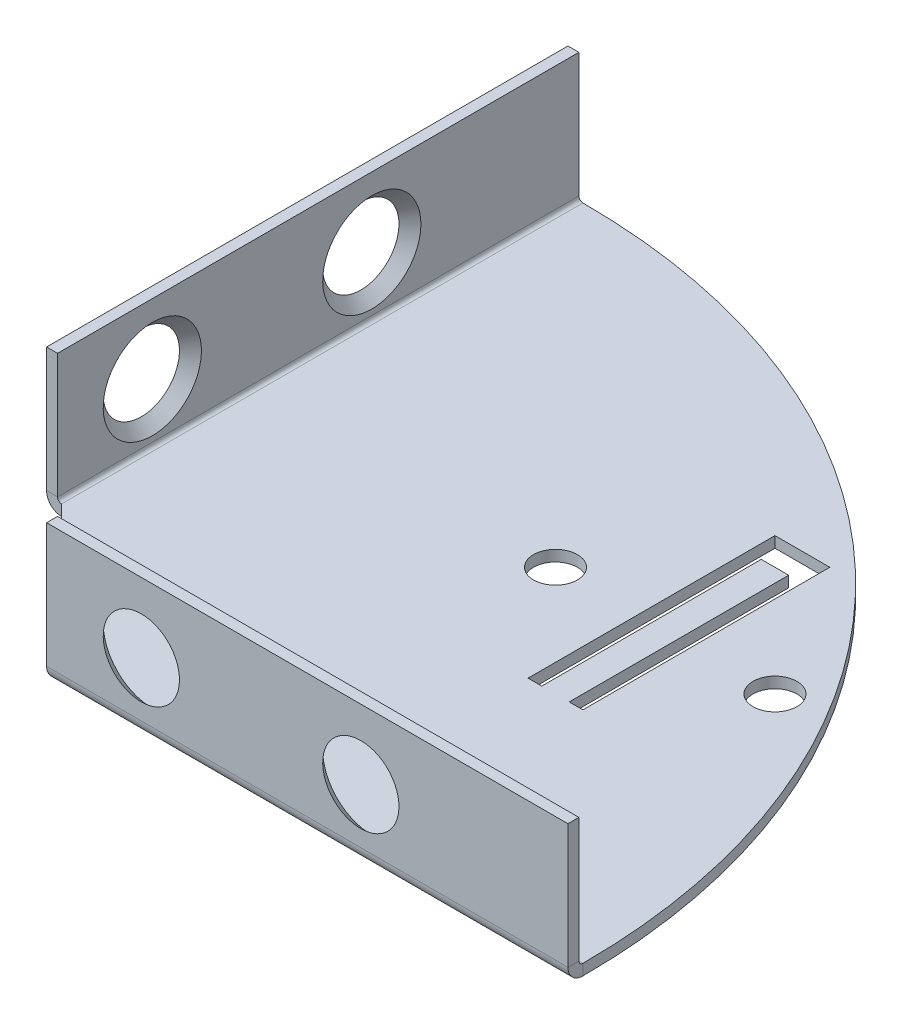
ISO-10303-21;
HEADER;
FILE_DESCRIPTION(('STEP AP214'),'2;1');
FILE_NAME('part.step','',(''),(''),'','','');
FILE_SCHEMA(('AUTOMOTIVE_DESIGN { 1 0 10303 214 1 1 1 1 }'));
ENDSEC;
DATA;
#1=APPLICATION_CONTEXT('core data for automotive mechanical design processes');
#2=APPLICATION_PROTOCOL_DEFINITION('international standard','automotive_design',2000,#1);
#3=PRODUCT_CONTEXT('',#1,'mechanical');
#4=PRODUCT('Part','Part','',(#3));
#5=PRODUCT_RELATED_PRODUCT_CATEGORY('part','',(#4));
#6=PRODUCT_DEFINITION_FORMATION('','',#4);
#7=PRODUCT_DEFINITION_CONTEXT('part definition',#1,'design');
#8=PRODUCT_DEFINITION('design','',#6,#7);
#9=PRODUCT_DEFINITION_SHAPE('','',#8);
#10=(LENGTH_UNIT() NAMED_UNIT(*) SI_UNIT(.MILLI.,.METRE.));
#11=(NAMED_UNIT(*) PLANE_ANGLE_UNIT() SI_UNIT($,.RADIAN.));
#12=(NAMED_UNIT(*) SI_UNIT($,.STERADIAN.) SOLID_ANGLE_UNIT());
#13=UNCERTAINTY_MEASURE_WITH_UNIT(LENGTH_MEASURE(1.E-05),#10,'distance_accuracy_value','');
#14=(GEOMETRIC_REPRESENTATION_CONTEXT(3) GLOBAL_UNCERTAINTY_ASSIGNED_CONTEXT((#13)) GLOBAL_UNIT_ASSIGNED_CONTEXT((#10,
#11,#12)) REPRESENTATION_CONTEXT('',''));
#15=CARTESIAN_POINT('',(0.,0.,0.));
#16=DIRECTION('',(0.,0.,1.));
#17=DIRECTION('',(1.,0.,0.));
#18=AXIS2_PLACEMENT_3D('',#15,#16,#17);
#19=CARTESIAN_POINT('',(0.,-2.,0.));
#20=DIRECTION('',(0.,1.,0.));
#21=DIRECTION('',(0.,0.,1.));
#22=AXIS2_PLACEMENT_3D('',#19,#20,#21);
#23=CYLINDRICAL_SURFACE('',#22,120.);
#24=CARTESIAN_POINT('',(0.,0.,0.));
#25=DIRECTION('',(0.,1.,0.));
#26=DIRECTION('',(0.,0.,1.));
#27=AXIS2_PLACEMENT_3D('',#24,#25,#26);
#28=CIRCLE('',#27,120.);
#29=CARTESIAN_POINT('',(120.,0.,0.));
#30=VERTEX_POINT('',#29);
#31=CARTESIAN_POINT('',(0.,0.,-120.));
#32=VERTEX_POINT('',#31);
#33=EDGE_CURVE('E434',#30,#32,#28,.T.);
#34=ORIENTED_EDGE('',*,*,#33,.F.);
#35=DIRECTION('',(0.,1.,0.));
#36=VECTOR('',#35,1.);
#37=CARTESIAN_POINT('',(120.,-2.,0.));
#38=LINE('',#37,#36);
#39=CARTESIAN_POINT('',(120.,-2.00000000000001,0.));
#40=VERTEX_POINT('',#39);
#41=EDGE_CURVE('E13',#40,#30,#38,.T.);
#42=ORIENTED_EDGE('',*,*,#41,.F.);
#43=CARTESIAN_POINT('',(0.,-2.,0.));
#44=DIRECTION('',(0.,1.,0.));
#45=DIRECTION('',(0.,0.,1.));
#46=AXIS2_PLACEMENT_3D('',#43,#44,#45);
#47=CIRCLE('',#46,120.);
#48=CARTESIAN_POINT('',(0.,-2.,-120.));
#49=VERTEX_POINT('',#48);
#50=EDGE_CURVE('E446',#40,#49,#47,.T.);
#51=ORIENTED_EDGE('',*,*,#50,.T.);
#52=DIRECTION('',(0.,1.,0.));
#53=VECTOR('',#52,1.);
#54=CARTESIAN_POINT('',(0.,-2.,-120.));
#55=LINE('',#54,#53);
#56=EDGE_CURVE('E89',#49,#32,#55,.T.);
#57=ORIENTED_EDGE('',*,*,#56,.T.);
#58=EDGE_LOOP('',(#34,#42,#51,#57));
#59=FACE_BOUND('',#58,.T.);
#60=ADVANCED_FACE('F86',(#59),#23,.T.);
#61=CARTESIAN_POINT('',(0.,-2.,-25.));
#62=DIRECTION('',(-0.707106781186547,0.,0.707106781186547));
#63=DIRECTION('',(0.707106781186548,0.,0.707106781186548));
#64=AXIS2_PLACEMENT_3D('',#61,#62,#63);
#65=PLANE('',#64);
#66=DIRECTION('',(0.707106781186547,0.,0.707106781186547));
#67=VECTOR('',#66,1.);
#68=CARTESIAN_POINT('',(0.,0.,-25.));
#69=LINE('',#68,#67);
#70=CARTESIAN_POINT('',(0.,0.,-25.));
#71=VERTEX_POINT('',#70);
#72=CARTESIAN_POINT('',(25.,0.,0.));
#73=VERTEX_POINT('',#72);
#74=EDGE_CURVE('E469',#71,#73,#69,.T.);
#75=ORIENTED_EDGE('',*,*,#74,.F.);
#76=DIRECTION('',(0.,1.,0.));
#77=VECTOR('',#76,1.);
#78=CARTESIAN_POINT('',(0.,-2.,-25.));
#79=LINE('',#78,#77);
#80=CARTESIAN_POINT('',(0.,-2.,-25.));
#81=VERTEX_POINT('',#80);
#82=EDGE_CURVE('E477',#81,#71,#79,.T.);
#83=ORIENTED_EDGE('',*,*,#82,.F.);
#84=DIRECTION('',(0.707106781186547,0.,0.707106781186547));
#85=VECTOR('',#84,1.);
#86=CARTESIAN_POINT('',(0.,-2.,-25.));
#87=LINE('',#86,#85);
#88=CARTESIAN_POINT('',(25.,-2.,0.));
#89=VERTEX_POINT('',#88);
#90=EDGE_CURVE('E455',#81,#89,#87,.T.);
#91=ORIENTED_EDGE('',*,*,#90,.T.);
#92=DIRECTION('',(0.,1.,0.));
#93=VECTOR('',#92,1.);
#94=CARTESIAN_POINT('',(25.,-2.,0.));
#95=LINE('',#94,#93);
#96=EDGE_CURVE('E95',#89,#73,#95,.T.);
#97=ORIENTED_EDGE('',*,*,#96,.T.);
#98=EDGE_LOOP('',(#75,#83,#91,#97));
#99=FACE_BOUND('',#98,.T.);
#100=ADVANCED_FACE('F522',(#99),#65,.T.);
#101=CARTESIAN_POINT('',(0.,-2.,0.));
#102=DIRECTION('',(0.,1.,0.));
#103=DIRECTION('',(0.,0.,1.));
#104=AXIS2_PLACEMENT_3D('',#101,#102,#103);
#105=PLANE('',#104);
#106=CARTESIAN_POINT('',(55.,-2.,-60.));
#107=DIRECTION('',(0.,1.,0.));
#108=DIRECTION('',(0.,0.,1.));
#109=AXIS2_PLACEMENT_3D('',#106,#107,#108);
#110=CIRCLE('',#109,4.00000000000001);
#111=CARTESIAN_POINT('',(55.,-2.,-56.));
#112=VERTEX_POINT('',#111);
#113=EDGE_CURVE('E321',#112,#112,#110,.T.);
#114=ORIENTED_EDGE('',*,*,#113,.T.);
#115=EDGE_LOOP('',(#114));
#116=FACE_BOUND('',#115,.T.);
#117=CARTESIAN_POINT('',(95.,-2.,-60.));
#118=DIRECTION('',(0.,1.,0.));
#119=DIRECTION('',(0.,0.,1.));
#120=AXIS2_PLACEMENT_3D('',#117,#118,#119);
#121=CIRCLE('',#120,4.00000000000001);
#122=CARTESIAN_POINT('',(95.,-2.,-56.));
#123=VERTEX_POINT('',#122);
#124=EDGE_CURVE('E317',#123,#123,#121,.T.);
#125=ORIENTED_EDGE('',*,*,#124,.T.);
#126=EDGE_LOOP('',(#125));
#127=FACE_BOUND('',#126,.T.);
#128=DIRECTION('',(1.,0.,0.));
#129=VECTOR('',#128,1.);
#130=CARTESIAN_POINT('',(0.,-2.,-80.));
#131=LINE('',#130,#129);
#132=CARTESIAN_POINT('',(72.5,-2.,-80.));
#133=VERTEX_POINT('',#132);
#134=CARTESIAN_POINT('',(77.5,-2.,-80.));
#135=VERTEX_POINT('',#134);
#136=EDGE_CURVE('E309',#133,#135,#131,.T.);
#137=ORIENTED_EDGE('',*,*,#136,.T.);
#138=DIRECTION('',(0.,0.,1.));
#139=VECTOR('',#138,1.);
#140=CARTESIAN_POINT('',(77.5,-2.,0.));
#141=LINE('',#140,#139);
#142=CARTESIAN_POINT('',(77.5,-2.,-40.));
#143=VERTEX_POINT('',#142);
#144=EDGE_CURVE('E313',#135,#143,#141,.T.);
#145=ORIENTED_EDGE('',*,*,#144,.T.);
#146=DIRECTION('',(1.,0.,0.));
#147=VECTOR('',#146,1.);
#148=CARTESIAN_POINT('',(0.,-2.,-40.));
#149=LINE('',#148,#147);
#150=CARTESIAN_POINT('',(80.,-2.,-40.));
#151=VERTEX_POINT('',#150);
#152=EDGE_CURVE('E290',#143,#151,#149,.T.);
#153=ORIENTED_EDGE('',*,*,#152,.T.);
#154=DIRECTION('',(0.,0.,1.));
#155=VECTOR('',#154,1.);
#156=CARTESIAN_POINT('',(80.,-2.,0.));
#157=LINE('',#156,#155);
#158=CARTESIAN_POINT('',(80.,-2.,-85.));
#159=VERTEX_POINT('',#158);
#160=EDGE_CURVE('E231',#159,#151,#157,.T.);
#161=ORIENTED_EDGE('',*,*,#160,.F.);
#162=DIRECTION('',(1.,0.,0.));
#163=VECTOR('',#162,1.);
#164=CARTESIAN_POINT('',(0.,-2.,-85.));
#165=LINE('',#164,#163);
#166=CARTESIAN_POINT('',(70.,-2.,-85.));
#167=VERTEX_POINT('',#166);
#168=EDGE_CURVE('E296',#167,#159,#165,.T.);
#169=ORIENTED_EDGE('',*,*,#168,.F.);
#170=DIRECTION('',(0.,0.,1.));
#171=VECTOR('',#170,1.);
#172=CARTESIAN_POINT('',(70.,-2.,0.));
#173=LINE('',#172,#171);
#174=CARTESIAN_POINT('',(70.,-2.,-40.));
#175=VERTEX_POINT('',#174);
#176=EDGE_CURVE('E299',#167,#175,#173,.T.);
#177=ORIENTED_EDGE('',*,*,#176,.T.);
#178=DIRECTION('',(-1.,0.,0.));
#179=VECTOR('',#178,1.);
#180=CARTESIAN_POINT('',(1.11022302462517E-13,-2.,-40.0000000000002));
#181=LINE('',#180,#179);
#182=CARTESIAN_POINT('',(72.5,-2.,-40.));
#183=VERTEX_POINT('',#182);
#184=EDGE_CURVE('E303',#183,#175,#181,.T.);
#185=ORIENTED_EDGE('',*,*,#184,.F.);
#186=DIRECTION('',(0.,0.,1.));
#187=VECTOR('',#186,1.);
#188=CARTESIAN_POINT('',(72.5,-2.,0.));
#189=LINE('',#188,#187);
#190=EDGE_CURVE('E306',#133,#183,#189,.T.);
#191=ORIENTED_EDGE('',*,*,#190,.F.);
#192=EDGE_LOOP('',(#137,#145,#153,#161,#169,#177,#185,#191));
#193=FACE_BOUND('',#192,.T.);
#194=ORIENTED_EDGE('',*,*,#50,.F.);
#195=DIRECTION('',(1.,0.,0.));
#196=VECTOR('',#195,1.);
#197=CARTESIAN_POINT('',(25.,-2.,0.));
#198=LINE('',#197,#196);
#199=EDGE_CURVE('E458',#89,#40,#198,.T.);
#200=ORIENTED_EDGE('',*,*,#199,.F.);
#201=ORIENTED_EDGE('',*,*,#90,.F.);
#202=DIRECTION('',(0.,0.,1.));
#203=VECTOR('',#202,1.);
#204=CARTESIAN_POINT('',(0.,-2.,-120.));
#205=LINE('',#204,#203);
#206=EDGE_CURVE('E450',#49,#81,#205,.T.);
#207=ORIENTED_EDGE('',*,*,#206,.F.);
#208=EDGE_LOOP('',(#194,#200,#201,#207));
#209=FACE_BOUND('',#208,.T.);
#210=ADVANCED_FACE('F518',(#116,#127,#193,#209),#105,.F.);
#211=CARTESIAN_POINT('',(0.,0.,0.));
#212=DIRECTION('',(0.,1.,0.));
#213=DIRECTION('',(0.,0.,1.));
#214=AXIS2_PLACEMENT_3D('',#211,#212,#213);
#215=PLANE('',#214);
#216=CARTESIAN_POINT('',(55.,0.,-60.));
#217=DIRECTION('',(0.,1.,0.));
#218=DIRECTION('',(0.,0.,1.));
#219=AXIS2_PLACEMENT_3D('',#216,#217,#218);
#220=CIRCLE('',#219,4.00000000000001);
#221=CARTESIAN_POINT('',(55.,0.,-56.));
#222=VERTEX_POINT('',#221);
#223=EDGE_CURVE('E293',#222,#222,#220,.T.);
#224=ORIENTED_EDGE('',*,*,#223,.F.);
#225=EDGE_LOOP('',(#224));
#226=FACE_BOUND('',#225,.T.);
#227=CARTESIAN_POINT('',(95.,0.,-60.));
#228=DIRECTION('',(0.,1.,0.));
#229=DIRECTION('',(0.,0.,1.));
#230=AXIS2_PLACEMENT_3D('',#227,#228,#229);
#231=CIRCLE('',#230,4.00000000000001);
#232=CARTESIAN_POINT('',(95.,0.,-56.));
#233=VERTEX_POINT('',#232);
#234=EDGE_CURVE('E273',#233,#233,#231,.T.);
#235=ORIENTED_EDGE('',*,*,#234,.F.);
#236=EDGE_LOOP('',(#235));
#237=FACE_BOUND('',#236,.T.);
#238=DIRECTION('',(0.,0.,1.));
#239=VECTOR('',#238,1.);
#240=CARTESIAN_POINT('',(77.5,0.,0.));
#241=LINE('',#240,#239);
#242=CARTESIAN_POINT('',(77.5,0.,-80.));
#243=VERTEX_POINT('',#242);
#244=CARTESIAN_POINT('',(77.5,0.,-40.));
#245=VERTEX_POINT('',#244);
#246=EDGE_CURVE('E111',#243,#245,#241,.T.);
#247=ORIENTED_EDGE('',*,*,#246,.F.);
#248=DIRECTION('',(1.,0.,0.));
#249=VECTOR('',#248,1.);
#250=CARTESIAN_POINT('',(0.,0.,-80.));
#251=LINE('',#250,#249);
#252=CARTESIAN_POINT('',(72.5,0.,-80.));
#253=VERTEX_POINT('',#252);
#254=EDGE_CURVE('E266',#253,#243,#251,.T.);
#255=ORIENTED_EDGE('',*,*,#254,.F.);
#256=DIRECTION('',(0.,0.,1.));
#257=VECTOR('',#256,1.);
#258=CARTESIAN_POINT('',(72.5,0.,0.));
#259=LINE('',#258,#257);
#260=CARTESIAN_POINT('',(72.5,0.,-40.));
#261=VERTEX_POINT('',#260);
#262=EDGE_CURVE('E262',#253,#261,#259,.T.);
#263=ORIENTED_EDGE('',*,*,#262,.T.);
#264=DIRECTION('',(-1.,0.,0.));
#265=VECTOR('',#264,1.);
#266=CARTESIAN_POINT('',(1.11022302462517E-13,0.,-40.0000000000002));
#267=LINE('',#266,#265);
#268=CARTESIAN_POINT('',(70.,0.,-40.));
#269=VERTEX_POINT('',#268);
#270=EDGE_CURVE('E258',#261,#269,#267,.T.);
#271=ORIENTED_EDGE('',*,*,#270,.T.);
#272=DIRECTION('',(0.,0.,1.));
#273=VECTOR('',#272,1.);
#274=CARTESIAN_POINT('',(70.,0.,0.));
#275=LINE('',#274,#273);
#276=CARTESIAN_POINT('',(70.,0.,-85.));
#277=VERTEX_POINT('',#276);
#278=EDGE_CURVE('E251',#277,#269,#275,.T.);
#279=ORIENTED_EDGE('',*,*,#278,.F.);
#280=DIRECTION('',(1.,0.,0.));
#281=VECTOR('',#280,1.);
#282=CARTESIAN_POINT('',(0.,0.,-85.));
#283=LINE('',#282,#281);
#284=CARTESIAN_POINT('',(80.,0.,-85.));
#285=VERTEX_POINT('',#284);
#286=EDGE_CURVE('E247',#277,#285,#283,.T.);
#287=ORIENTED_EDGE('',*,*,#286,.T.);
#288=DIRECTION('',(0.,0.,1.));
#289=VECTOR('',#288,1.);
#290=CARTESIAN_POINT('',(80.,0.,0.));
#291=LINE('',#290,#289);
#292=CARTESIAN_POINT('',(80.,0.,-40.));
#293=VERTEX_POINT('',#292);
#294=EDGE_CURVE('E228',#285,#293,#291,.T.);
#295=ORIENTED_EDGE('',*,*,#294,.T.);
#296=DIRECTION('',(1.,0.,0.));
#297=VECTOR('',#296,1.);
#298=CARTESIAN_POINT('',(0.,0.,-40.));
#299=LINE('',#298,#297);
#300=EDGE_CURVE('E238',#245,#293,#299,.T.);
#301=ORIENTED_EDGE('',*,*,#300,.F.);
#302=EDGE_LOOP('',(#247,#255,#263,#271,#279,#287,#295,#301));
#303=FACE_BOUND('',#302,.T.);
#304=ORIENTED_EDGE('',*,*,#33,.T.);
#305=DIRECTION('',(0.,0.,1.));
#306=VECTOR('',#305,1.);
#307=CARTESIAN_POINT('',(0.,0.,-120.));
#308=LINE('',#307,#306);
#309=EDGE_CURVE('E465',#32,#71,#308,.T.);
#310=ORIENTED_EDGE('',*,*,#309,.T.);
#311=ORIENTED_EDGE('',*,*,#74,.T.);
#312=DIRECTION('',(1.,0.,0.));
#313=VECTOR('',#312,1.);
#314=CARTESIAN_POINT('',(25.,0.,0.));
#315=LINE('',#314,#313);
#316=EDGE_CURVE('E451',#73,#30,#315,.T.);
#317=ORIENTED_EDGE('',*,*,#316,.T.);
#318=EDGE_LOOP('',(#304,#310,#311,#317));
#319=FACE_BOUND('',#318,.T.);
#320=ADVANCED_FACE('F243',(#226,#237,#303,#319),#215,.T.);
#321=CARTESIAN_POINT('',(25.,0.736599999999997,0.));
#322=DIRECTION('',(-1.,0.,0.));
#323=DIRECTION('',(0.,0.,1.));
#324=AXIS2_PLACEMENT_3D('',#321,#322,#323);
#325=PLANE('',#324);
#326=DIRECTION('',(0.,0.,1.));
#327=VECTOR('',#326,1.);
#328=CARTESIAN_POINT('',(25.,0.736599999999997,2.73660000000008));
#329=LINE('',#328,#327);
#330=CARTESIAN_POINT('',(25.,0.736599999999995,0.7366));
#331=VERTEX_POINT('',#330);
#332=CARTESIAN_POINT('',(25.,0.736599999999988,2.7366));
#333=VERTEX_POINT('',#332);
#334=EDGE_CURVE('E374',#331,#333,#329,.T.);
#335=ORIENTED_EDGE('',*,*,#334,.F.);
#336=CARTESIAN_POINT('',(25.,0.736599999999997,0.));
#337=DIRECTION('',(1.,0.,0.));
#338=DIRECTION('',(0.,0.,-1.));
#339=AXIS2_PLACEMENT_3D('',#336,#337,#338);
#340=CIRCLE('',#339,0.736600000000003);
#341=EDGE_CURVE('E439',#73,#331,#340,.F.);
#342=ORIENTED_EDGE('',*,*,#341,.F.);
#343=ORIENTED_EDGE('',*,*,#96,.F.);
#344=CARTESIAN_POINT('',(25.,0.736599999999997,0.));
#345=DIRECTION('',(1.,0.,0.));
#346=DIRECTION('',(0.,0.,-1.));
#347=AXIS2_PLACEMENT_3D('',#344,#345,#346);
#348=CIRCLE('',#347,2.7366);
#349=EDGE_CURVE('E430',#89,#333,#348,.F.);
#350=ORIENTED_EDGE('',*,*,#349,.T.);
#351=EDGE_LOOP('',(#335,#342,#343,#350));
#352=FACE_BOUND('',#351,.T.);
#353=ADVANCED_FACE('F529',(#352),#325,.T.);
#354=CARTESIAN_POINT('',(120.,0.736599999999997,0.));
#355=DIRECTION('',(-1.,0.,0.));
#356=DIRECTION('',(0.,0.,1.));
#357=AXIS2_PLACEMENT_3D('',#354,#355,#356);
#358=PLANE('',#357);
#359=CARTESIAN_POINT('',(120.,0.736599999999997,0.));
#360=DIRECTION('',(1.,0.,0.));
#361=DIRECTION('',(0.,0.,-1.));
#362=AXIS2_PLACEMENT_3D('',#359,#360,#361);
#363=CIRCLE('',#362,0.736600000000003);
#364=CARTESIAN_POINT('',(120.,0.736599999999995,0.736600000000007));
#365=VERTEX_POINT('',#364);
#366=EDGE_CURVE('E389',#365,#30,#363,.T.);
#367=ORIENTED_EDGE('',*,*,#366,.F.);
#368=DIRECTION('',(0.,0.,1.));
#369=VECTOR('',#368,1.);
#370=CARTESIAN_POINT('',(120.,0.736599999999997,0.7366));
#371=LINE('',#370,#369);
#372=CARTESIAN_POINT('',(120.,0.736599999999997,2.7366));
#373=VERTEX_POINT('',#372);
#374=EDGE_CURVE('E420',#365,#373,#371,.T.);
#375=ORIENTED_EDGE('',*,*,#374,.T.);
#376=CARTESIAN_POINT('',(120.,0.736599999999997,0.));
#377=DIRECTION('',(1.,0.,0.));
#378=DIRECTION('',(0.,0.,-1.));
#379=AXIS2_PLACEMENT_3D('',#376,#377,#378);
#380=CIRCLE('',#379,2.7366);
#381=EDGE_CURVE('E435',#373,#40,#380,.T.);
#382=ORIENTED_EDGE('',*,*,#381,.T.);
#383=ORIENTED_EDGE('',*,*,#41,.T.);
#384=EDGE_LOOP('',(#367,#375,#382,#383));
#385=FACE_BOUND('',#384,.T.);
#386=ADVANCED_FACE('F550',(#385),#358,.F.);
#387=CARTESIAN_POINT('',(120.,0.736599999999997,0.));
#388=DIRECTION('',(1.,0.,0.));
#389=DIRECTION('',(0.,0.,1.));
#390=AXIS2_PLACEMENT_3D('',#387,#388,#389);
#391=CYLINDRICAL_SURFACE('',#390,2.7366);
#392=ORIENTED_EDGE('',*,*,#199,.T.);
#393=ORIENTED_EDGE('',*,*,#381,.F.);
#394=DIRECTION('',(1.,0.,0.));
#395=VECTOR('',#394,1.);
#396=CARTESIAN_POINT('',(0.,0.736599999999997,2.7366));
#397=LINE('',#396,#395);
#398=EDGE_CURVE('E416',#333,#373,#397,.T.);
#399=ORIENTED_EDGE('',*,*,#398,.F.);
#400=ORIENTED_EDGE('',*,*,#349,.F.);
#401=EDGE_LOOP('',(#392,#393,#399,#400));
#402=FACE_BOUND('',#401,.T.);
#403=ADVANCED_FACE('F552',(#402),#391,.T.);
#404=CARTESIAN_POINT('',(120.,0.736599999999997,0.));
#405=DIRECTION('',(1.,0.,0.));
#406=DIRECTION('',(0.,0.,1.));
#407=AXIS2_PLACEMENT_3D('',#404,#405,#406);
#408=CYLINDRICAL_SURFACE('',#407,0.736600000000003);
#409=ORIENTED_EDGE('',*,*,#316,.F.);
#410=ORIENTED_EDGE('',*,*,#341,.T.);
#411=DIRECTION('',(-1.,0.,0.));
#412=VECTOR('',#411,1.);
#413=CARTESIAN_POINT('',(25.,0.736599999999997,0.7366));
#414=LINE('',#413,#412);
#415=EDGE_CURVE('E424',#331,#365,#414,.F.);
#416=ORIENTED_EDGE('',*,*,#415,.T.);
#417=ORIENTED_EDGE('',*,*,#366,.T.);
#418=EDGE_LOOP('',(#409,#410,#416,#417));
#419=FACE_BOUND('',#418,.T.);
#420=ADVANCED_FACE('F525',(#419),#408,.F.);
#421=CARTESIAN_POINT('',(120.,0.,2.7366));
#422=DIRECTION('',(1.,0.,0.));
#423=DIRECTION('',(0.,0.,-1.));
#424=AXIS2_PLACEMENT_3D('',#421,#422,#423);
#425=PLANE('',#424);
#426=DIRECTION('',(0.,-1.,0.));
#427=VECTOR('',#426,1.);
#428=CARTESIAN_POINT('',(120.,0.,2.7366));
#429=LINE('',#428,#427);
#430=CARTESIAN_POINT('',(120.,23.4,2.73660000000008));
#431=VERTEX_POINT('',#430);
#432=EDGE_CURVE('E394',#431,#373,#429,.T.);
#433=ORIENTED_EDGE('',*,*,#432,.T.);
#434=ORIENTED_EDGE('',*,*,#374,.F.);
#435=DIRECTION('',(0.,1.,0.));
#436=VECTOR('',#435,1.);
#437=CARTESIAN_POINT('',(120.,0.,0.736599999999997));
#438=LINE('',#437,#436);
#439=CARTESIAN_POINT('',(120.,23.4,0.736600000000079));
#440=VERTEX_POINT('',#439);
#441=EDGE_CURVE('E405',#440,#365,#438,.F.);
#442=ORIENTED_EDGE('',*,*,#441,.F.);
#443=DIRECTION('',(0.,0.,-1.));
#444=VECTOR('',#443,1.);
#445=CARTESIAN_POINT('',(120.,23.4,2.73660000000008));
#446=LINE('',#445,#444);
#447=EDGE_CURVE('E386',#431,#440,#446,.T.);
#448=ORIENTED_EDGE('',*,*,#447,.F.);
#449=EDGE_LOOP('',(#433,#434,#442,#448));
#450=FACE_BOUND('',#449,.T.);
#451=ADVANCED_FACE('F548',(#450),#425,.T.);
#452=CARTESIAN_POINT('',(25.,23.4,2.73660000000008));
#453=DIRECTION('',(-1.,0.,0.));
#454=DIRECTION('',(0.,0.,1.));
#455=AXIS2_PLACEMENT_3D('',#452,#453,#454);
#456=PLANE('',#455);
#457=DIRECTION('',(0.,-1.,0.));
#458=VECTOR('',#457,1.);
#459=CARTESIAN_POINT('',(25.,0.,0.736599999999997));
#460=LINE('',#459,#458);
#461=CARTESIAN_POINT('',(25.,23.4,0.736600000000079));
#462=VERTEX_POINT('',#461);
#463=EDGE_CURVE('E413',#331,#462,#460,.F.);
#464=ORIENTED_EDGE('',*,*,#463,.F.);
#465=ORIENTED_EDGE('',*,*,#334,.T.);
#466=DIRECTION('',(0.,1.,0.));
#467=VECTOR('',#466,1.);
#468=CARTESIAN_POINT('',(25.,23.4,2.73660000000008));
#469=LINE('',#468,#467);
#470=CARTESIAN_POINT('',(25.,23.4,2.73660000000008));
#471=VERTEX_POINT('',#470);
#472=EDGE_CURVE('E402',#333,#471,#469,.T.);
#473=ORIENTED_EDGE('',*,*,#472,.T.);
#474=DIRECTION('',(0.,0.,-1.));
#475=VECTOR('',#474,1.);
#476=CARTESIAN_POINT('',(25.,23.4,2.73660000000008));
#477=LINE('',#476,#475);
#478=EDGE_CURVE('E390',#471,#462,#477,.T.);
#479=ORIENTED_EDGE('',*,*,#478,.T.);
#480=EDGE_LOOP('',(#464,#465,#473,#479));
#481=FACE_BOUND('',#480,.T.);
#482=ADVANCED_FACE('F534',(#481),#456,.T.);
#483=CARTESIAN_POINT('',(0.,0.,2.7366));
#484=DIRECTION('',(0.,0.,1.));
#485=DIRECTION('',(0.,-1.,0.));
#486=AXIS2_PLACEMENT_3D('',#483,#484,#485);
#487=PLANE('',#486);
#488=CARTESIAN_POINT('',(42.2634,10.7,2.73660000000003));
#489=DIRECTION('',(0.,0.,-1.));
#490=DIRECTION('',(0.,1.,0.));
#491=AXIS2_PLACEMENT_3D('',#488,#489,#490);
#492=CIRCLE('',#491,6.94999999999999);
#493=CARTESIAN_POINT('',(42.2634,17.65,2.73660000000006));
#494=VERTEX_POINT('',#493);
#495=EDGE_CURVE('E922',#494,#494,#492,.T.);
#496=ORIENTED_EDGE('',*,*,#495,.T.);
#497=EDGE_LOOP('',(#496));
#498=FACE_BOUND('',#497,.T.);
#499=CARTESIAN_POINT('',(82.2634,10.7,2.73660000000003));
#500=DIRECTION('',(0.,0.,-1.));
#501=DIRECTION('',(0.,1.,0.));
#502=AXIS2_PLACEMENT_3D('',#499,#500,#501);
#503=CIRCLE('',#502,6.94999999999999);
#504=CARTESIAN_POINT('',(82.2634,17.65,2.73660000000006));
#505=VERTEX_POINT('',#504);
#506=EDGE_CURVE('E923',#505,#505,#503,.T.);
#507=ORIENTED_EDGE('',*,*,#506,.T.);
#508=EDGE_LOOP('',(#507));
#509=FACE_BOUND('',#508,.T.);
#510=ORIENTED_EDGE('',*,*,#472,.F.);
#511=ORIENTED_EDGE('',*,*,#398,.T.);
#512=ORIENTED_EDGE('',*,*,#432,.F.);
#513=DIRECTION('',(1.,0.,0.));
#514=VECTOR('',#513,1.);
#515=CARTESIAN_POINT('',(120.,23.4,2.73660000000008));
#516=LINE('',#515,#514);
#517=EDGE_CURVE('E398',#471,#431,#516,.T.);
#518=ORIENTED_EDGE('',*,*,#517,.F.);
#519=EDGE_LOOP('',(#510,#511,#512,#518));
#520=FACE_BOUND('',#519,.T.);
#521=ADVANCED_FACE('F538',(#498,#509,#520),#487,.T.);
#522=CARTESIAN_POINT('',(0.,0.,0.736599999999997));
#523=DIRECTION('',(0.,0.,1.));
#524=DIRECTION('',(0.,-1.,0.));
#525=AXIS2_PLACEMENT_3D('',#522,#523,#524);
#526=PLANE('',#525);
#527=CARTESIAN_POINT('',(42.2634,10.7,0.736600000000035));
#528=DIRECTION('',(0.,0.,-1.));
#529=DIRECTION('',(0.,1.,0.));
#530=AXIS2_PLACEMENT_3D('',#527,#528,#529);
#531=CIRCLE('',#530,8.95);
#532=CARTESIAN_POINT('',(42.2634,19.65,0.736600000000066));
#533=VERTEX_POINT('',#532);
#534=EDGE_CURVE('E918',#533,#533,#531,.T.);
#535=ORIENTED_EDGE('',*,*,#534,.F.);
#536=EDGE_LOOP('',(#535));
#537=FACE_BOUND('',#536,.T.);
#538=CARTESIAN_POINT('',(82.2634,10.7,0.736600000000035));
#539=DIRECTION('',(0.,0.,-1.));
#540=DIRECTION('',(0.,1.,0.));
#541=AXIS2_PLACEMENT_3D('',#538,#539,#540);
#542=CIRCLE('',#541,8.95);
#543=CARTESIAN_POINT('',(82.2634,19.65,0.736600000000066));
#544=VERTEX_POINT('',#543);
#545=EDGE_CURVE('E909',#544,#544,#542,.T.);
#546=ORIENTED_EDGE('',*,*,#545,.F.);
#547=EDGE_LOOP('',(#546));
#548=FACE_BOUND('',#547,.T.);
#549=ORIENTED_EDGE('',*,*,#415,.F.);
#550=ORIENTED_EDGE('',*,*,#463,.T.);
#551=DIRECTION('',(-1.,0.,0.));
#552=VECTOR('',#551,1.);
#553=CARTESIAN_POINT('',(0.,23.4,0.736600000000079));
#554=LINE('',#553,#552);
#555=EDGE_CURVE('E409',#462,#440,#554,.F.);
#556=ORIENTED_EDGE('',*,*,#555,.T.);
#557=ORIENTED_EDGE('',*,*,#441,.T.);
#558=EDGE_LOOP('',(#549,#550,#556,#557));
#559=FACE_BOUND('',#558,.T.);
#560=ADVANCED_FACE('F545',(#537,#548,#559),#526,.F.);
#561=CARTESIAN_POINT('',(120.,23.4,2.73660000000008));
#562=DIRECTION('',(0.,1.,0.));
#563=DIRECTION('',(0.,0.,1.));
#564=AXIS2_PLACEMENT_3D('',#561,#562,#563);
#565=PLANE('',#564);
#566=ORIENTED_EDGE('',*,*,#555,.F.);
#567=ORIENTED_EDGE('',*,*,#478,.F.);
#568=ORIENTED_EDGE('',*,*,#517,.T.);
#569=ORIENTED_EDGE('',*,*,#447,.T.);
#570=EDGE_LOOP('',(#566,#567,#568,#569));
#571=FACE_BOUND('',#570,.T.);
#572=ADVANCED_FACE('F542',(#571),#565,.T.);
#573=CARTESIAN_POINT('',(0.,0.7366,-120.));
#574=DIRECTION('',(0.,0.,-1.));
#575=DIRECTION('',(-1.,0.,0.));
#576=AXIS2_PLACEMENT_3D('',#573,#574,#575);
#577=PLANE('',#576);
#578=DIRECTION('',(-1.,0.,0.));
#579=VECTOR('',#578,1.);
#580=CARTESIAN_POINT('',(-2.7366,0.73659999999999,-120.));
#581=LINE('',#580,#579);
#582=CARTESIAN_POINT('',(-0.7366,0.736599999999997,-120.));
#583=VERTEX_POINT('',#582);
#584=CARTESIAN_POINT('',(-2.7366,0.73659999999999,-120.));
#585=VERTEX_POINT('',#584);
#586=EDGE_CURVE('E325',#583,#585,#581,.T.);
#587=ORIENTED_EDGE('',*,*,#586,.F.);
#588=CARTESIAN_POINT('',(0.,0.7366,-120.));
#589=DIRECTION('',(0.,0.,1.));
#590=DIRECTION('',(1.,0.,0.));
#591=AXIS2_PLACEMENT_3D('',#588,#589,#590);
#592=CIRCLE('',#591,0.736599999999996);
#593=EDGE_CURVE('E379',#32,#583,#592,.F.);
#594=ORIENTED_EDGE('',*,*,#593,.F.);
#595=ORIENTED_EDGE('',*,*,#56,.F.);
#596=CARTESIAN_POINT('',(0.,0.7366,-120.));
#597=DIRECTION('',(0.,0.,1.));
#598=DIRECTION('',(1.,0.,0.));
#599=AXIS2_PLACEMENT_3D('',#596,#597,#598);
#600=CIRCLE('',#599,2.7366);
#601=EDGE_CURVE('E370',#49,#585,#600,.F.);
#602=ORIENTED_EDGE('',*,*,#601,.T.);
#603=EDGE_LOOP('',(#587,#594,#595,#602));
#604=FACE_BOUND('',#603,.T.);
#605=ADVANCED_FACE('F495',(#604),#577,.T.);
#606=CARTESIAN_POINT('',(0.,0.7366,-25.));
#607=DIRECTION('',(0.,0.,-1.));
#608=DIRECTION('',(-1.,0.,0.));
#609=AXIS2_PLACEMENT_3D('',#606,#607,#608);
#610=PLANE('',#609);
#611=CARTESIAN_POINT('',(0.,0.7366,-25.));
#612=DIRECTION('',(0.,0.,1.));
#613=DIRECTION('',(1.,0.,0.));
#614=AXIS2_PLACEMENT_3D('',#611,#612,#613);
#615=CIRCLE('',#614,0.736599999999996);
#616=CARTESIAN_POINT('',(-0.736599999999993,0.736599999999997,-25.));
#617=VERTEX_POINT('',#616);
#618=EDGE_CURVE('E329',#617,#71,#615,.T.);
#619=ORIENTED_EDGE('',*,*,#618,.F.);
#620=DIRECTION('',(-1.,0.,0.));
#621=VECTOR('',#620,1.);
#622=CARTESIAN_POINT('',(-0.7366,0.736599999999997,-25.));
#623=LINE('',#622,#621);
#624=CARTESIAN_POINT('',(-2.7366,0.73659999999999,-25.));
#625=VERTEX_POINT('',#624);
#626=EDGE_CURVE('E360',#617,#625,#623,.T.);
#627=ORIENTED_EDGE('',*,*,#626,.T.);
#628=CARTESIAN_POINT('',(0.,0.7366,-25.));
#629=DIRECTION('',(0.,0.,1.));
#630=DIRECTION('',(1.,0.,0.));
#631=AXIS2_PLACEMENT_3D('',#628,#629,#630);
#632=CIRCLE('',#631,2.7366);
#633=EDGE_CURVE('E375',#625,#81,#632,.T.);
#634=ORIENTED_EDGE('',*,*,#633,.T.);
#635=ORIENTED_EDGE('',*,*,#82,.T.);
#636=EDGE_LOOP('',(#619,#627,#634,#635));
#637=FACE_BOUND('',#636,.T.);
#638=ADVANCED_FACE('F514',(#637),#610,.F.);
#639=CARTESIAN_POINT('',(0.,0.7366,-25.));
#640=DIRECTION('',(0.,0.,1.));
#641=DIRECTION('',(-1.,0.,0.));
#642=AXIS2_PLACEMENT_3D('',#639,#640,#641);
#643=CYLINDRICAL_SURFACE('',#642,2.7366);
#644=ORIENTED_EDGE('',*,*,#206,.T.);
#645=ORIENTED_EDGE('',*,*,#633,.F.);
#646=DIRECTION('',(0.,0.,1.));
#647=VECTOR('',#646,1.);
#648=CARTESIAN_POINT('',(-2.7366,0.73659999999999,0.));
#649=LINE('',#648,#647);
#650=EDGE_CURVE('E356',#585,#625,#649,.T.);
#651=ORIENTED_EDGE('',*,*,#650,.F.);
#652=ORIENTED_EDGE('',*,*,#601,.F.);
#653=EDGE_LOOP('',(#644,#645,#651,#652));
#654=FACE_BOUND('',#653,.T.);
#655=ADVANCED_FACE('F516',(#654),#643,.T.);
#656=CARTESIAN_POINT('',(0.,0.7366,-25.));
#657=DIRECTION('',(0.,0.,1.));
#658=DIRECTION('',(-1.,0.,0.));
#659=AXIS2_PLACEMENT_3D('',#656,#657,#658);
#660=CYLINDRICAL_SURFACE('',#659,0.736599999999996);
#661=ORIENTED_EDGE('',*,*,#309,.F.);
#662=ORIENTED_EDGE('',*,*,#593,.T.);
#663=DIRECTION('',(0.,0.,-1.));
#664=VECTOR('',#663,1.);
#665=CARTESIAN_POINT('',(-0.7366,0.736599999999997,-120.));
#666=LINE('',#665,#664);
#667=EDGE_CURVE('E364',#583,#617,#666,.F.);
#668=ORIENTED_EDGE('',*,*,#667,.T.);
#669=ORIENTED_EDGE('',*,*,#618,.T.);
#670=EDGE_LOOP('',(#661,#662,#668,#669));
#671=FACE_BOUND('',#670,.T.);
#672=ADVANCED_FACE('F493',(#671),#660,.F.);
#673=CARTESIAN_POINT('',(-2.7366,0.,-25.));
#674=DIRECTION('',(0.,0.,1.));
#675=DIRECTION('',(1.,0.,0.));
#676=AXIS2_PLACEMENT_3D('',#673,#674,#675);
#677=PLANE('',#676);
#678=DIRECTION('',(0.,-1.,0.));
#679=VECTOR('',#678,1.);
#680=CARTESIAN_POINT('',(-2.7366,0.,-25.));
#681=LINE('',#680,#679);
#682=CARTESIAN_POINT('',(-2.73660000000008,23.4,-25.));
#683=VERTEX_POINT('',#682);
#684=EDGE_CURVE('E334',#683,#625,#681,.T.);
#685=ORIENTED_EDGE('',*,*,#684,.T.);
#686=ORIENTED_EDGE('',*,*,#626,.F.);
#687=DIRECTION('',(0.,1.,0.));
#688=VECTOR('',#687,1.);
#689=CARTESIAN_POINT('',(-0.736599999999997,0.,-25.));
#690=LINE('',#689,#688);
#691=CARTESIAN_POINT('',(-0.736600000000079,23.4,-25.));
#692=VERTEX_POINT('',#691);
#693=EDGE_CURVE('E345',#692,#617,#690,.F.);
#694=ORIENTED_EDGE('',*,*,#693,.F.);
#695=DIRECTION('',(1.,0.,0.));
#696=VECTOR('',#695,1.);
#697=CARTESIAN_POINT('',(-2.73660000000008,23.4,-25.));
#698=LINE('',#697,#696);
#699=EDGE_CURVE('E326',#683,#692,#698,.T.);
#700=ORIENTED_EDGE('',*,*,#699,.F.);
#701=EDGE_LOOP('',(#685,#686,#694,#700));
#702=FACE_BOUND('',#701,.T.);
#703=ADVANCED_FACE('F513',(#702),#677,.T.);
#704=CARTESIAN_POINT('',(-2.73660000000008,23.4,-120.));
#705=DIRECTION('',(0.,0.,-1.));
#706=DIRECTION('',(-1.,0.,0.));
#707=AXIS2_PLACEMENT_3D('',#704,#705,#706);
#708=PLANE('',#707);
#709=DIRECTION('',(0.,-1.,0.));
#710=VECTOR('',#709,1.);
#711=CARTESIAN_POINT('',(-0.736599999999997,0.,-120.));
#712=LINE('',#711,#710);
#713=CARTESIAN_POINT('',(-0.736600000000079,23.4,-120.));
#714=VERTEX_POINT('',#713);
#715=EDGE_CURVE('E353',#583,#714,#712,.F.);
#716=ORIENTED_EDGE('',*,*,#715,.F.);
#717=ORIENTED_EDGE('',*,*,#586,.T.);
#718=DIRECTION('',(0.,1.,0.));
#719=VECTOR('',#718,1.);
#720=CARTESIAN_POINT('',(-2.73660000000008,23.4,-120.));
#721=LINE('',#720,#719);
#722=CARTESIAN_POINT('',(-2.73660000000008,23.4,-120.));
#723=VERTEX_POINT('',#722);
#724=EDGE_CURVE('E342',#585,#723,#721,.T.);
#725=ORIENTED_EDGE('',*,*,#724,.T.);
#726=DIRECTION('',(1.,0.,0.));
#727=VECTOR('',#726,1.);
#728=CARTESIAN_POINT('',(-2.73660000000008,23.4,-120.));
#729=LINE('',#728,#727);
#730=EDGE_CURVE('E330',#723,#714,#729,.T.);
#731=ORIENTED_EDGE('',*,*,#730,.T.);
#732=EDGE_LOOP('',(#716,#717,#725,#731));
#733=FACE_BOUND('',#732,.T.);
#734=ADVANCED_FACE('F499',(#733),#708,.T.);
#735=CARTESIAN_POINT('',(-2.7366,0.,0.));
#736=DIRECTION('',(-1.,0.,0.));
#737=DIRECTION('',(0.,-1.,0.));
#738=AXIS2_PLACEMENT_3D('',#735,#736,#737);
#739=PLANE('',#738);
#740=CARTESIAN_POINT('',(-2.73660000000003,10.6999999999996,-42.2633999999999));
#741=DIRECTION('',(1.,0.,0.));
#742=DIRECTION('',(0.,1.,0.));
#743=AXIS2_PLACEMENT_3D('',#740,#741,#742);
#744=CIRCLE('',#743,6.94999999999999);
#745=CARTESIAN_POINT('',(-2.73660000000006,17.6499999999996,-42.2633999999999));
#746=VERTEX_POINT('',#745);
#747=EDGE_CURVE('E900',#746,#746,#744,.T.);
#748=ORIENTED_EDGE('',*,*,#747,.T.);
#749=EDGE_LOOP('',(#748));
#750=FACE_BOUND('',#749,.T.);
#751=CARTESIAN_POINT('',(-2.73660000000003,10.6999999999996,-82.2633999999999));
#752=DIRECTION('',(1.,0.,0.));
#753=DIRECTION('',(0.,1.,0.));
#754=AXIS2_PLACEMENT_3D('',#751,#752,#753);
#755=CIRCLE('',#754,6.94999999999999);
#756=CARTESIAN_POINT('',(-2.73660000000006,17.6499999999996,-82.2633999999999));
#757=VERTEX_POINT('',#756);
#758=EDGE_CURVE('E905',#757,#757,#755,.T.);
#759=ORIENTED_EDGE('',*,*,#758,.T.);
#760=EDGE_LOOP('',(#759));
#761=FACE_BOUND('',#760,.T.);
#762=ORIENTED_EDGE('',*,*,#724,.F.);
#763=ORIENTED_EDGE('',*,*,#650,.T.);
#764=ORIENTED_EDGE('',*,*,#684,.F.);
#765=DIRECTION('',(0.,0.,1.));
#766=VECTOR('',#765,1.);
#767=CARTESIAN_POINT('',(-2.73660000000008,23.4,-25.));
#768=LINE('',#767,#766);
#769=EDGE_CURVE('E338',#723,#683,#768,.T.);
#770=ORIENTED_EDGE('',*,*,#769,.F.);
#771=EDGE_LOOP('',(#762,#763,#764,#770));
#772=FACE_BOUND('',#771,.T.);
#773=ADVANCED_FACE('F503',(#750,#761,#772),#739,.T.);
#774=CARTESIAN_POINT('',(-0.736599999999997,0.,0.));
#775=DIRECTION('',(-1.,0.,0.));
#776=DIRECTION('',(0.,-1.,0.));
#777=AXIS2_PLACEMENT_3D('',#774,#775,#776);
#778=PLANE('',#777);
#779=CARTESIAN_POINT('',(-0.736600000000035,10.6999999999996,-42.2633999999999));
#780=DIRECTION('',(1.,0.,0.));
#781=DIRECTION('',(0.,1.,0.));
#782=AXIS2_PLACEMENT_3D('',#779,#780,#781);
#783=CIRCLE('',#782,8.95);
#784=CARTESIAN_POINT('',(-0.736600000000066,19.6499999999996,-42.2633999999999));
#785=VERTEX_POINT('',#784);
#786=EDGE_CURVE('E903',#785,#785,#783,.T.);
#787=ORIENTED_EDGE('',*,*,#786,.F.);
#788=EDGE_LOOP('',(#787));
#789=FACE_BOUND('',#788,.T.);
#790=CARTESIAN_POINT('',(-0.736600000000035,10.6999999999996,-82.2633999999999));
#791=DIRECTION('',(1.,0.,0.));
#792=DIRECTION('',(0.,1.,0.));
#793=AXIS2_PLACEMENT_3D('',#790,#791,#792);
#794=CIRCLE('',#793,8.95);
#795=CARTESIAN_POINT('',(-0.736600000000066,19.6499999999996,-82.2633999999999));
#796=VERTEX_POINT('',#795);
#797=EDGE_CURVE('E912',#796,#796,#794,.T.);
#798=ORIENTED_EDGE('',*,*,#797,.F.);
#799=EDGE_LOOP('',(#798));
#800=FACE_BOUND('',#799,.T.);
#801=ORIENTED_EDGE('',*,*,#667,.F.);
#802=ORIENTED_EDGE('',*,*,#715,.T.);
#803=DIRECTION('',(0.,0.,-1.));
#804=VECTOR('',#803,1.);
#805=CARTESIAN_POINT('',(-0.736600000000079,23.4,0.));
#806=LINE('',#805,#804);
#807=EDGE_CURVE('E349',#714,#692,#806,.F.);
#808=ORIENTED_EDGE('',*,*,#807,.T.);
#809=ORIENTED_EDGE('',*,*,#693,.T.);
#810=EDGE_LOOP('',(#801,#802,#808,#809));
#811=FACE_BOUND('',#810,.T.);
#812=ADVANCED_FACE('F510',(#789,#800,#811),#778,.F.);
#813=CARTESIAN_POINT('',(-2.73660000000008,23.4,-25.));
#814=DIRECTION('',(0.,1.,0.));
#815=DIRECTION('',(-1.,0.,0.));
#816=AXIS2_PLACEMENT_3D('',#813,#814,#815);
#817=PLANE('',#816);
#818=ORIENTED_EDGE('',*,*,#807,.F.);
#819=ORIENTED_EDGE('',*,*,#730,.F.);
#820=ORIENTED_EDGE('',*,*,#769,.T.);
#821=ORIENTED_EDGE('',*,*,#699,.T.);
#822=EDGE_LOOP('',(#818,#819,#820,#821));
#823=FACE_BOUND('',#822,.T.);
#824=ADVANCED_FACE('F507',(#823),#817,.T.);
#825=CARTESIAN_POINT('',(77.5,-10.,0.));
#826=DIRECTION('',(-1.,0.,0.));
#827=DIRECTION('',(0.,0.,1.));
#828=AXIS2_PLACEMENT_3D('',#825,#826,#827);
#829=PLANE('',#828);
#830=DIRECTION('',(0.,1.,0.));
#831=VECTOR('',#830,1.);
#832=CARTESIAN_POINT('',(77.5,-10.,-80.));
#833=LINE('',#832,#831);
#834=EDGE_CURVE('E270',#135,#243,#833,.T.);
#835=ORIENTED_EDGE('',*,*,#834,.T.);
#836=ORIENTED_EDGE('',*,*,#246,.T.);
#837=DIRECTION('',(0.,1.,0.));
#838=VECTOR('',#837,1.);
#839=CARTESIAN_POINT('',(77.5,-10.,-40.));
#840=LINE('',#839,#838);
#841=EDGE_CURVE('E235',#143,#245,#840,.T.);
#842=ORIENTED_EDGE('',*,*,#841,.F.);
#843=ORIENTED_EDGE('',*,*,#144,.F.);
#844=EDGE_LOOP('',(#835,#836,#842,#843));
#845=FACE_BOUND('',#844,.T.);
#846=ADVANCED_FACE('F703',(#845),#829,.F.);
#847=CARTESIAN_POINT('',(0.,-10.,-80.));
#848=DIRECTION('',(0.,0.,1.));
#849=DIRECTION('',(1.,0.,0.));
#850=AXIS2_PLACEMENT_3D('',#847,#848,#849);
#851=PLANE('',#850);
#852=DIRECTION('',(0.,1.,0.));
#853=VECTOR('',#852,1.);
#854=CARTESIAN_POINT('',(72.5,-10.,-80.));
#855=LINE('',#854,#853);
#856=EDGE_CURVE('E274',#133,#253,#855,.T.);
#857=ORIENTED_EDGE('',*,*,#856,.T.);
#858=ORIENTED_EDGE('',*,*,#254,.T.);
#859=ORIENTED_EDGE('',*,*,#834,.F.);
#860=ORIENTED_EDGE('',*,*,#136,.F.);
#861=EDGE_LOOP('',(#857,#858,#859,#860));
#862=FACE_BOUND('',#861,.T.);
#863=ADVANCED_FACE('F726',(#862),#851,.F.);
#864=CARTESIAN_POINT('',(72.5,-10.,0.));
#865=DIRECTION('',(-1.,0.,0.));
#866=DIRECTION('',(0.,0.,1.));
#867=AXIS2_PLACEMENT_3D('',#864,#865,#866);
#868=PLANE('',#867);
#869=ORIENTED_EDGE('',*,*,#190,.T.);
#870=DIRECTION('',(0.,1.,0.));
#871=VECTOR('',#870,1.);
#872=CARTESIAN_POINT('',(72.5,-10.,-40.));
#873=LINE('',#872,#871);
#874=EDGE_CURVE('E277',#183,#261,#873,.T.);
#875=ORIENTED_EDGE('',*,*,#874,.T.);
#876=ORIENTED_EDGE('',*,*,#262,.F.);
#877=ORIENTED_EDGE('',*,*,#856,.F.);
#878=EDGE_LOOP('',(#869,#875,#876,#877));
#879=FACE_BOUND('',#878,.T.);
#880=ADVANCED_FACE('F736',(#879),#868,.T.);
#881=CARTESIAN_POINT('',(1.11022302462517E-13,-10.,-40.0000000000002));
#882=DIRECTION('',(0.,0.,-1.));
#883=DIRECTION('',(-1.,0.,0.));
#884=AXIS2_PLACEMENT_3D('',#881,#882,#883);
#885=PLANE('',#884);
#886=ORIENTED_EDGE('',*,*,#184,.T.);
#887=DIRECTION('',(0.,1.,0.));
#888=VECTOR('',#887,1.);
#889=CARTESIAN_POINT('',(70.,-10.,-40.));
#890=LINE('',#889,#888);
#891=EDGE_CURVE('E280',#175,#269,#890,.T.);
#892=ORIENTED_EDGE('',*,*,#891,.T.);
#893=ORIENTED_EDGE('',*,*,#270,.F.);
#894=ORIENTED_EDGE('',*,*,#874,.F.);
#895=EDGE_LOOP('',(#886,#892,#893,#894));
#896=FACE_BOUND('',#895,.T.);
#897=ADVANCED_FACE('F747',(#896),#885,.T.);
#898=CARTESIAN_POINT('',(70.,-10.,0.));
#899=DIRECTION('',(-1.,0.,0.));
#900=DIRECTION('',(0.,0.,1.));
#901=AXIS2_PLACEMENT_3D('',#898,#899,#900);
#902=PLANE('',#901);
#903=DIRECTION('',(0.,1.,0.));
#904=VECTOR('',#903,1.);
#905=CARTESIAN_POINT('',(70.,-10.,-85.));
#906=LINE('',#905,#904);
#907=EDGE_CURVE('E283',#167,#277,#906,.T.);
#908=ORIENTED_EDGE('',*,*,#907,.T.);
#909=ORIENTED_EDGE('',*,*,#278,.T.);
#910=ORIENTED_EDGE('',*,*,#891,.F.);
#911=ORIENTED_EDGE('',*,*,#176,.F.);
#912=EDGE_LOOP('',(#908,#909,#910,#911));
#913=FACE_BOUND('',#912,.T.);
#914=ADVANCED_FACE('F758',(#913),#902,.F.);
#915=CARTESIAN_POINT('',(0.,-10.,-85.));
#916=DIRECTION('',(0.,0.,1.));
#917=DIRECTION('',(1.,0.,0.));
#918=AXIS2_PLACEMENT_3D('',#915,#916,#917);
#919=PLANE('',#918);
#920=ORIENTED_EDGE('',*,*,#168,.T.);
#921=DIRECTION('',(0.,1.,0.));
#922=VECTOR('',#921,1.);
#923=CARTESIAN_POINT('',(80.,-10.,-85.));
#924=LINE('',#923,#922);
#925=EDGE_CURVE('E234',#159,#285,#924,.T.);
#926=ORIENTED_EDGE('',*,*,#925,.T.);
#927=ORIENTED_EDGE('',*,*,#286,.F.);
#928=ORIENTED_EDGE('',*,*,#907,.F.);
#929=EDGE_LOOP('',(#920,#926,#927,#928));
#930=FACE_BOUND('',#929,.T.);
#931=ADVANCED_FACE('F769',(#930),#919,.T.);
#932=CARTESIAN_POINT('',(80.,-10.,0.));
#933=DIRECTION('',(-1.,0.,0.));
#934=DIRECTION('',(0.,0.,1.));
#935=AXIS2_PLACEMENT_3D('',#932,#933,#934);
#936=PLANE('',#935);
#937=ORIENTED_EDGE('',*,*,#160,.T.);
#938=DIRECTION('',(0.,1.,0.));
#939=VECTOR('',#938,1.);
#940=CARTESIAN_POINT('',(80.,-10.,-40.));
#941=LINE('',#940,#939);
#942=EDGE_CURVE('E103',#151,#293,#941,.T.);
#943=ORIENTED_EDGE('',*,*,#942,.T.);
#944=ORIENTED_EDGE('',*,*,#294,.F.);
#945=ORIENTED_EDGE('',*,*,#925,.F.);
#946=EDGE_LOOP('',(#937,#943,#944,#945));
#947=FACE_BOUND('',#946,.T.);
#948=ADVANCED_FACE('F225',(#947),#936,.T.);
#949=CARTESIAN_POINT('',(0.,-10.,-40.));
#950=DIRECTION('',(0.,0.,1.));
#951=DIRECTION('',(1.,0.,0.));
#952=AXIS2_PLACEMENT_3D('',#949,#950,#951);
#953=PLANE('',#952);
#954=ORIENTED_EDGE('',*,*,#841,.T.);
#955=ORIENTED_EDGE('',*,*,#300,.T.);
#956=ORIENTED_EDGE('',*,*,#942,.F.);
#957=ORIENTED_EDGE('',*,*,#152,.F.);
#958=EDGE_LOOP('',(#954,#955,#956,#957));
#959=FACE_BOUND('',#958,.T.);
#960=ADVANCED_FACE('F239',(#959),#953,.F.);
#961=CARTESIAN_POINT('',(95.,-10.,-60.));
#962=DIRECTION('',(0.,1.,0.));
#963=DIRECTION('',(0.,0.,1.));
#964=AXIS2_PLACEMENT_3D('',#961,#962,#963);
#965=CYLINDRICAL_SURFACE('',#964,4.00000000000001);
#966=ORIENTED_EDGE('',*,*,#234,.T.);
#967=EDGE_LOOP('',(#966));
#968=FACE_BOUND('',#967,.T.);
#969=ORIENTED_EDGE('',*,*,#124,.F.);
#970=EDGE_LOOP('',(#969));
#971=FACE_BOUND('',#970,.T.);
#972=ADVANCED_FACE('F799',(#968,#971),#965,.F.);
#973=CARTESIAN_POINT('',(55.,-10.,-60.));
#974=DIRECTION('',(0.,1.,0.));
#975=DIRECTION('',(0.,0.,1.));
#976=AXIS2_PLACEMENT_3D('',#973,#974,#975);
#977=CYLINDRICAL_SURFACE('',#976,4.00000000000001);
#978=ORIENTED_EDGE('',*,*,#223,.T.);
#979=EDGE_LOOP('',(#978));
#980=FACE_BOUND('',#979,.T.);
#981=ORIENTED_EDGE('',*,*,#113,.F.);
#982=EDGE_LOOP('',(#981));
#983=FACE_BOUND('',#982,.T.);
#984=ADVANCED_FACE('F809',(#980,#983),#977,.F.);
#985=CARTESIAN_POINT('',(82.2634,10.7,0.736600000000035));
#986=DIRECTION('',(0.,0.,-1.));
#987=DIRECTION('',(0.,1.,0.));
#988=AXIS2_PLACEMENT_3D('',#985,#986,#987);
#989=CONICAL_SURFACE('',#988,8.95,0.78539816339745);
#990=ORIENTED_EDGE('',*,*,#506,.F.);
#991=EDGE_LOOP('',(#990));
#992=FACE_BOUND('',#991,.T.);
#993=ORIENTED_EDGE('',*,*,#545,.T.);
#994=EDGE_LOOP('',(#993));
#995=FACE_BOUND('',#994,.T.);
#996=ADVANCED_FACE('F820',(#992,#995),#989,.F.);
#997=CARTESIAN_POINT('',(42.2634,10.7,0.736600000000035));
#998=DIRECTION('',(0.,0.,-1.));
#999=DIRECTION('',(0.,1.,0.));
#1000=AXIS2_PLACEMENT_3D('',#997,#998,#999);
#1001=CONICAL_SURFACE('',#1000,8.95,0.78539816339745);
#1002=ORIENTED_EDGE('',*,*,#495,.F.);
#1003=EDGE_LOOP('',(#1002));
#1004=FACE_BOUND('',#1003,.T.);
#1005=ORIENTED_EDGE('',*,*,#534,.T.);
#1006=EDGE_LOOP('',(#1005));
#1007=FACE_BOUND('',#1006,.T.);
#1008=ADVANCED_FACE('F847',(#1004,#1007),#1001,.F.);
#1009=CARTESIAN_POINT('',(-0.736600000000035,10.6999999999996,-82.2633999999999));
#1010=DIRECTION('',(1.,0.,0.));
#1011=DIRECTION('',(0.,1.,0.));
#1012=AXIS2_PLACEMENT_3D('',#1009,#1010,#1011);
#1013=CONICAL_SURFACE('',#1012,8.95,0.78539816339745);
#1014=ORIENTED_EDGE('',*,*,#758,.F.);
#1015=EDGE_LOOP('',(#1014));
#1016=FACE_BOUND('',#1015,.T.);
#1017=ORIENTED_EDGE('',*,*,#797,.T.);
#1018=EDGE_LOOP('',(#1017));
#1019=FACE_BOUND('',#1018,.T.);
#1020=ADVANCED_FACE('F857',(#1016,#1019),#1013,.F.);
#1021=CARTESIAN_POINT('',(-0.736600000000035,10.6999999999996,-42.2633999999999));
#1022=DIRECTION('',(1.,0.,0.));
#1023=DIRECTION('',(0.,1.,0.));
#1024=AXIS2_PLACEMENT_3D('',#1021,#1022,#1023);
#1025=CONICAL_SURFACE('',#1024,8.95,0.78539816339745);
#1026=ORIENTED_EDGE('',*,*,#747,.F.);
#1027=EDGE_LOOP('',(#1026));
#1028=FACE_BOUND('',#1027,.T.);
#1029=ORIENTED_EDGE('',*,*,#786,.T.);
#1030=EDGE_LOOP('',(#1029));
#1031=FACE_BOUND('',#1030,.T.);
#1032=ADVANCED_FACE('F883',(#1028,#1031),#1025,.F.);
#1033=CLOSED_SHELL('',(#60,#100,#210,#320,#353,#386,#403,#420,#451,#482,#521,#560,#572,#605,
#638,#655,#672,#703,#734,#773,#812,#824,#846,#863,#880,#897,#914,#931,#948,#960,#972,#984,#996,
#1008,#1020,#1032));
#1034=MANIFOLD_SOLID_BREP('B2',#1033);
#1035=ADVANCED_BREP_SHAPE_REPRESENTATION('',(#18,#1034),#14);
#1036=SHAPE_DEFINITION_REPRESENTATION(#9,#1035);
ENDSEC;
END-ISO-10303-21;
